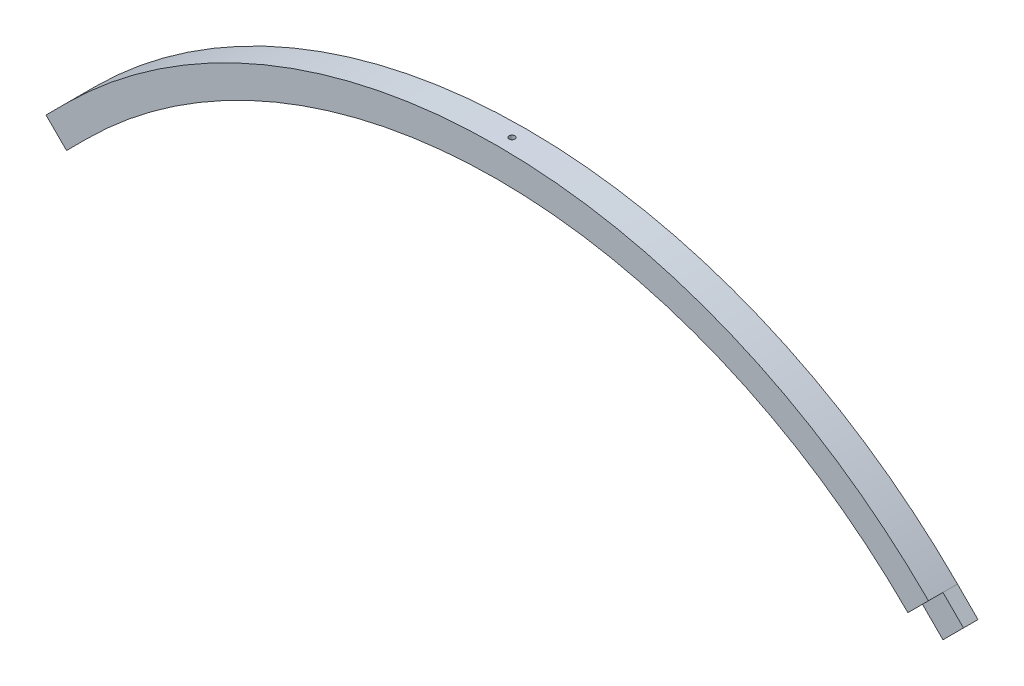
ISO-10303-21;
HEADER;
FILE_DESCRIPTION(('STEP AP214'),'2;1');
FILE_NAME('part.step','',(''),(''),'','','');
FILE_SCHEMA(('AUTOMOTIVE_DESIGN { 1 0 10303 214 1 1 1 1 }'));
ENDSEC;
DATA;
#1=APPLICATION_CONTEXT('core data for automotive mechanical design processes');
#2=APPLICATION_PROTOCOL_DEFINITION('international standard','automotive_design',2000,#1);
#3=PRODUCT_CONTEXT('',#1,'mechanical');
#4=PRODUCT('Part','Part','',(#3));
#5=PRODUCT_RELATED_PRODUCT_CATEGORY('part','',(#4));
#6=PRODUCT_DEFINITION_FORMATION('','',#4);
#7=PRODUCT_DEFINITION_CONTEXT('part definition',#1,'design');
#8=PRODUCT_DEFINITION('design','',#6,#7);
#9=PRODUCT_DEFINITION_SHAPE('','',#8);
#10=(LENGTH_UNIT() NAMED_UNIT(*) SI_UNIT(.MILLI.,.METRE.));
#11=(NAMED_UNIT(*) PLANE_ANGLE_UNIT() SI_UNIT($,.RADIAN.));
#12=(NAMED_UNIT(*) SI_UNIT($,.STERADIAN.) SOLID_ANGLE_UNIT());
#13=UNCERTAINTY_MEASURE_WITH_UNIT(LENGTH_MEASURE(1.E-05),#10,'distance_accuracy_value','');
#14=(GEOMETRIC_REPRESENTATION_CONTEXT(3) GLOBAL_UNCERTAINTY_ASSIGNED_CONTEXT((#13)) GLOBAL_UNIT_ASSIGNED_CONTEXT((#10,
#11,#12)) REPRESENTATION_CONTEXT('',''));
#15=CARTESIAN_POINT('',(0.,0.,0.));
#16=DIRECTION('',(0.,0.,1.));
#17=DIRECTION('',(1.,0.,0.));
#18=AXIS2_PLACEMENT_3D('',#15,#16,#17);
#19=CARTESIAN_POINT('',(0.,0.,184.));
#20=DIRECTION('',(0.707106781186547,0.707106781186547,0.));
#21=DIRECTION('',(-0.707106781186548,0.707106781186548,0.));
#22=AXIS2_PLACEMENT_3D('',#19,#20,#21);
#23=PLANE('',#22);
#24=DIRECTION('',(0.707106781186548,-0.707106781186548,0.));
#25=VECTOR('',#24,1.);
#26=CARTESIAN_POINT('',(0.,0.,5.));
#27=LINE('',#26,#25);
#28=CARTESIAN_POINT('',(-148.492424049175,148.492424049175,5.));
#29=VERTEX_POINT('',#28);
#30=CARTESIAN_POINT('',(-141.42135623731,141.42135623731,5.));
#31=VERTEX_POINT('',#30);
#32=EDGE_CURVE('E58',#29,#31,#27,.T.);
#33=ORIENTED_EDGE('',*,*,#32,.F.);
#34=DIRECTION('',(0.,0.,-1.));
#35=VECTOR('',#34,1.);
#36=CARTESIAN_POINT('',(-148.492424049175,148.492424049175,184.));
#37=LINE('',#36,#35);
#38=CARTESIAN_POINT('',(-148.492424049175,148.492424049175,0.));
#39=VERTEX_POINT('',#38);
#40=EDGE_CURVE('E198',#29,#39,#37,.T.);
#41=ORIENTED_EDGE('',*,*,#40,.T.);
#42=DIRECTION('',(-0.707106781186548,0.707106781186548,0.));
#43=VECTOR('',#42,1.);
#44=CARTESIAN_POINT('',(0.,0.,0.));
#45=LINE('',#44,#43);
#46=CARTESIAN_POINT('',(-141.42135623731,141.42135623731,0.));
#47=VERTEX_POINT('',#46);
#48=EDGE_CURVE('E11',#47,#39,#45,.T.);
#49=ORIENTED_EDGE('',*,*,#48,.F.);
#50=DIRECTION('',(0.,0.,-1.));
#51=VECTOR('',#50,1.);
#52=CARTESIAN_POINT('',(-141.42135623731,141.42135623731,184.));
#53=LINE('',#52,#51);
#54=EDGE_CURVE('E201',#31,#47,#53,.T.);
#55=ORIENTED_EDGE('',*,*,#54,.F.);
#56=EDGE_LOOP('',(#33,#41,#49,#55));
#57=FACE_BOUND('',#56,.T.);
#58=ADVANCED_FACE('F41',(#57),#23,.F.);
#59=CARTESIAN_POINT('',(0.,0.,10.));
#60=DIRECTION('',(0.,0.,-1.));
#61=DIRECTION('',(-1.,0.,0.));
#62=AXIS2_PLACEMENT_3D('',#59,#60,#61);
#63=CYLINDRICAL_SURFACE('',#62,210.);
#64=CARTESIAN_POINT('',(0.,0.,0.));
#65=DIRECTION('',(0.,0.,1.));
#66=DIRECTION('',(1.,0.,0.));
#67=AXIS2_PLACEMENT_3D('',#64,#65,#66);
#68=CIRCLE('',#67,210.);
#69=CARTESIAN_POINT('',(148.492424049175,148.492424049175,0.));
#70=VERTEX_POINT('',#69);
#71=EDGE_CURVE('E240',#70,#39,#68,.T.);
#72=ORIENTED_EDGE('',*,*,#71,.T.);
#73=ORIENTED_EDGE('',*,*,#40,.F.);
#74=CARTESIAN_POINT('',(-148.492424049175,148.492424049175,10.));
#75=VERTEX_POINT('',#74);
#76=EDGE_CURVE('E145',#75,#29,#37,.T.);
#77=ORIENTED_EDGE('',*,*,#76,.F.);
#78=CARTESIAN_POINT('',(0.,0.,10.));
#79=DIRECTION('',(0.,0.,1.));
#80=DIRECTION('',(1.,0.,0.));
#81=AXIS2_PLACEMENT_3D('',#78,#79,#80);
#82=CIRCLE('',#81,210.);
#83=CARTESIAN_POINT('',(148.492424049175,148.492424049175,10.));
#84=VERTEX_POINT('',#83);
#85=EDGE_CURVE('E51',#84,#75,#82,.T.);
#86=ORIENTED_EDGE('',*,*,#85,.F.);
#87=DIRECTION('',(0.,0.,-1.));
#88=VECTOR('',#87,1.);
#89=CARTESIAN_POINT('',(148.492424049175,148.492424049175,184.));
#90=LINE('',#89,#88);
#91=CARTESIAN_POINT('',(148.492424049175,148.492424049175,5.));
#92=VERTEX_POINT('',#91);
#93=EDGE_CURVE('E195',#84,#92,#90,.T.);
#94=ORIENTED_EDGE('',*,*,#93,.T.);
#95=DIRECTION('',(0.,0.,1.));
#96=VECTOR('',#95,1.);
#97=CARTESIAN_POINT('',(148.492424049175,148.492424049175,0.));
#98=LINE('',#97,#96);
#99=EDGE_CURVE('E147',#70,#92,#98,.T.);
#100=ORIENTED_EDGE('',*,*,#99,.F.);
#101=EDGE_LOOP('',(#72,#73,#77,#86,#94,#100));
#102=FACE_BOUND('',#101,.T.);
#103=CARTESIAN_POINT('',(0.,210.,4.));
#104=CARTESIAN_POINT('',(-0.0561700973399885,209.999999967803,4.00000249072948));
#105=CARTESIAN_POINT('',(-0.112380915178687,209.999977221737,4.00474849993076));
#106=CARTESIAN_POINT('',(-0.223254452153493,209.999888669815,4.02361539952494));
#107=CARTESIAN_POINT('',(-0.277915225630178,209.999822812142,4.03774757186595));
#108=CARTESIAN_POINT('',(-0.384066351557266,209.999655497524,4.07498445734749));
#109=CARTESIAN_POINT('',(-0.435558205653359,209.999554057597,4.09808488220712));
#110=CARTESIAN_POINT('',(-0.533918386674478,209.999327030359,4.15259663996631));
#111=CARTESIAN_POINT('',(-0.580787858783418,209.999201449054,4.1840059072337));
#112=CARTESIAN_POINT('',(-0.668594596066591,209.998940265267,4.25425036170356));
#113=CARTESIAN_POINT('',(-0.709531197884227,209.998804661668,4.29308637816954));
#114=CARTESIAN_POINT('',(-0.784304886469968,209.998538727261,4.37708139440838));
#115=CARTESIAN_POINT('',(-0.818141694331727,209.99840839666,4.42224064246516));
#116=CARTESIAN_POINT('',(-0.877752940668733,209.998167710082,4.51759833817141));
#117=CARTESIAN_POINT('',(-0.903527491030073,209.998057353828,4.56779671587627));
#118=CARTESIAN_POINT('',(-0.946283091965778,209.997869055953,4.67180811907036));
#119=CARTESIAN_POINT('',(-0.963264160664983,209.997791114266,4.72562113710896));
#120=CARTESIAN_POINT('',(-0.98795074172505,209.997676433188,4.83533398512662));
#121=CARTESIAN_POINT('',(-0.995656307732284,209.99763969356,4.8912338030344));
#122=CARTESIAN_POINT('',(-1.00157329788507,209.997611558056,5.00353358583415));
#123=CARTESIAN_POINT('',(-0.999784739662276,209.997620162096,5.05993354979711));
#124=CARTESIAN_POINT('',(-0.986764350185382,209.99768174343,5.17163223702303));
#125=CARTESIAN_POINT('',(-0.975532592038613,209.997734720379,5.22693096880811));
#126=CARTESIAN_POINT('',(-0.943944735969814,209.997879074326,5.33485794818976));
#127=CARTESIAN_POINT('',(-0.923588628151769,209.997970451365,5.38748619288993));
#128=CARTESIAN_POINT('',(-0.874329840264295,209.998181303839,5.48857840571481));
#129=CARTESIAN_POINT('',(-0.845427127712873,209.998300779381,5.53704235801193));
#130=CARTESIAN_POINT('',(-0.77989563000023,209.998554358769,5.62843004975235));
#131=CARTESIAN_POINT('',(-0.743266847442498,209.998688462609,5.67135379106256));
#132=CARTESIAN_POINT('',(-0.663322546354162,209.998956181116,5.75044305703461));
#133=CARTESIAN_POINT('',(-0.620006960535205,209.999089795778,5.78660851368069));
#134=CARTESIAN_POINT('',(-0.527918886422356,209.999341470639,5.85115406065259));
#135=CARTESIAN_POINT('',(-0.479146397411753,209.999459530836,5.87953414995588));
#136=CARTESIAN_POINT('',(-0.377528994117669,209.999666786438,5.92770332020346));
#137=CARTESIAN_POINT('',(-0.324684079062943,209.999755981837,5.94749239952076));
#138=CARTESIAN_POINT('',(-0.216421951606891,209.999895451666,5.97791775511454));
#139=CARTESIAN_POINT('',(-0.16100473949489,209.999945726099,5.98855403242049));
#140=CARTESIAN_POINT('',(-0.0491717299330348,210.000001685626,6.00037177104708));
#141=CARTESIAN_POINT('',(0.00724405770100269,210.000007371156,6.00155332525426));
#142=CARTESIAN_POINT('',(0.119473255691313,209.999973513037,5.99442831857082));
#143=CARTESIAN_POINT('',(0.175286666038695,209.999933969386,5.98612175754015));
#144=CARTESIAN_POINT('',(0.284726473300373,209.999814111386,5.96025639473023));
#145=CARTESIAN_POINT('',(0.338352880060943,209.99973379722,5.94269763461096));
#146=CARTESIAN_POINT('',(0.44189668042276,209.999541452897,5.89882636017298));
#147=CARTESIAN_POINT('',(0.491814074307881,209.999429422743,5.87251384652424));
#148=CARTESIAN_POINT('',(0.586523271314924,209.999186275654,5.81188176289634));
#149=CARTESIAN_POINT('',(0.631315035010179,209.999055158573,5.7775621313321));
#150=CARTESIAN_POINT('',(0.714501088063849,209.998788620375,5.70189011962905));
#151=CARTESIAN_POINT('',(0.752895374487201,209.998653199255,5.66053773626375));
#152=CARTESIAN_POINT('',(0.822196870755759,209.99839331943,5.57197369125962));
#153=CARTESIAN_POINT('',(0.853104018393986,209.998268860815,5.52476198094343));
#154=CARTESIAN_POINT('',(0.906553421408002,209.998044939316,5.42581978542363));
#155=CARTESIAN_POINT('',(0.929095685867517,209.997945476405,5.37408930512719));
#156=CARTESIAN_POINT('',(0.965175348241904,209.997782760501,5.26757824846587));
#157=CARTESIAN_POINT('',(0.978712788452043,209.997719507338,5.21279768642839));
#158=CARTESIAN_POINT('',(0.996398671057786,209.997636341661,5.10174121818114));
#159=CARTESIAN_POINT('',(1.00054709716782,209.997616429221,5.04546530937781));
#160=CARTESIAN_POINT('',(0.999337140854348,209.997622190259,4.93301645391675));
#161=CARTESIAN_POINT('',(0.993978870486797,209.997647863199,4.87684350605322));
#162=CARTESIAN_POINT('',(0.973907825482695,209.99774189954,4.76619437855318));
#163=CARTESIAN_POINT('',(0.95919503204093,209.997810263027,4.7117182023279));
#164=CARTESIAN_POINT('',(0.920832275565876,209.997981974612,4.60600815560876));
#165=CARTESIAN_POINT('',(0.897182146248233,209.998085323362,4.55477434546173));
#166=CARTESIAN_POINT('',(0.841617083741863,209.99831534841,4.45700642896389));
#167=CARTESIAN_POINT('',(0.809702474426797,209.998442023794,4.41047213854464));
#168=CARTESIAN_POINT('',(0.738517837721311,209.998704411591,4.32342602311546));
#169=CARTESIAN_POINT('',(0.699248507436294,209.998840123146,4.28291362798209));
#170=CARTESIAN_POINT('',(0.614454354204032,209.999105329912,4.20904632239875));
#171=CARTESIAN_POINT('',(0.56892797903191,209.999234823569,4.17569319326952));
#172=CARTESIAN_POINT('',(0.472903899696185,209.999473015319,4.11709084541166));
#173=CARTESIAN_POINT('',(0.422403811002818,209.999581703364,4.09184553874331));
#174=CARTESIAN_POINT('',(0.317921617076429,209.999765817901,4.05022058909796));
#175=CARTESIAN_POINT('',(0.263943772994789,209.999841284243,4.03383031921432));
#176=CARTESIAN_POINT('',(0.174685001282033,209.999930168694,4.01474844785419));
#177=CARTESIAN_POINT('',(0.139984041965225,209.999956242606,4.00922468371461));
#178=CARTESIAN_POINT('',(0.0701940235052931,209.99999116832,4.00184968147773));
#179=CARTESIAN_POINT('',(0.0351049643649845,210.000000020122,3.99999844335378));
#180=CARTESIAN_POINT('',(0.,210.,4.));
#181=B_SPLINE_CURVE_WITH_KNOTS('',3,(#103,#104,#105,#106,#107,#108,#109,#110,#111,#112,#113,
#114,#115,#116,#117,#118,#119,#120,#121,#122,#123,#124,#125,#126,#127,#128,#129,#130,#131,#132,
#133,#134,#135,#136,#137,#138,#139,#140,#141,#142,#143,#144,#145,#146,#147,#148,#149,#150,#151,
#152,#153,#154,#155,#156,#157,#158,#159,#160,#161,#162,#163,#164,#165,#166,#167,#168,#169,#170,
#171,#172,#173,#174,#175,#176,#177,#178,#179,#180),.UNSPECIFIED.,.T.,.F.,(4,2,2,2,2,2,2,2,2,2,2,
2,2,2,2,2,2,2,2,2,2,2,2,2,2,2,2,2,2,2,2,2,2,2,2,2,2,2,4),(0.,0.168382158876448,
0.336967076326025,0.505471481899403,0.673934035488119,0.842415410434632,1.01090340271837,
1.17938905666208,1.34787436332721,1.51635869552558,1.68484271482985,1.85332542977724,
2.02180832745674,2.19029186547598,2.35877534672068,2.52726052350131,2.69574572241089,
2.86423095322859,3.03271616509554,3.20119972170207,3.36968328079536,3.53816608126234,
3.70664886883432,3.87513295229932,4.04361711306192,4.21210267362906,4.38058805123117,
4.54907263745922,4.71755751592946,4.8860404084725,5.05452363971448,5.22301000583974,
5.39148977021382,5.55995357357856,5.72845924451871,5.8970460984664,6.06543017979514,
6.1706649935101,6.27589980646188),.UNSPECIFIED.);
#182=CARTESIAN_POINT('',(0.,210.,4.));
#183=VERTEX_POINT('',#182);
#184=EDGE_CURVE('E210',#183,#183,#181,.T.);
#185=ORIENTED_EDGE('',*,*,#184,.F.);
#186=EDGE_LOOP('',(#185));
#187=FACE_BOUND('',#186,.T.);
#188=ADVANCED_FACE('F43',(#102,#187),#63,.T.);
#189=CARTESIAN_POINT('',(0.,0.,10.));
#190=DIRECTION('',(0.,0.,-1.));
#191=DIRECTION('',(-1.,0.,0.));
#192=AXIS2_PLACEMENT_3D('',#189,#190,#191);
#193=CYLINDRICAL_SURFACE('',#192,200.);
#194=CARTESIAN_POINT('',(-141.42135623731,141.42135623731,10.));
#195=VERTEX_POINT('',#194);
#196=EDGE_CURVE('E202',#195,#31,#53,.T.);
#197=ORIENTED_EDGE('',*,*,#196,.T.);
#198=ORIENTED_EDGE('',*,*,#54,.T.);
#199=CARTESIAN_POINT('',(0.,0.,0.));
#200=DIRECTION('',(0.,0.,1.));
#201=DIRECTION('',(1.,0.,0.));
#202=AXIS2_PLACEMENT_3D('',#199,#200,#201);
#203=CIRCLE('',#202,200.);
#204=CARTESIAN_POINT('',(141.42135623731,141.42135623731,0.));
#205=VERTEX_POINT('',#204);
#206=EDGE_CURVE('E218',#205,#47,#203,.T.);
#207=ORIENTED_EDGE('',*,*,#206,.F.);
#208=DIRECTION('',(0.,0.,-1.));
#209=VECTOR('',#208,1.);
#210=CARTESIAN_POINT('',(141.42135623731,141.42135623731,0.));
#211=LINE('',#210,#209);
#212=CARTESIAN_POINT('',(141.42135623731,141.42135623731,5.));
#213=VERTEX_POINT('',#212);
#214=EDGE_CURVE('E162',#213,#205,#211,.T.);
#215=ORIENTED_EDGE('',*,*,#214,.F.);
#216=DIRECTION('',(0.,0.,-1.));
#217=VECTOR('',#216,1.);
#218=CARTESIAN_POINT('',(141.42135623731,141.42135623731,184.));
#219=LINE('',#218,#217);
#220=CARTESIAN_POINT('',(141.42135623731,141.42135623731,10.));
#221=VERTEX_POINT('',#220);
#222=EDGE_CURVE('E192',#221,#213,#219,.T.);
#223=ORIENTED_EDGE('',*,*,#222,.F.);
#224=CARTESIAN_POINT('',(0.,0.,10.));
#225=DIRECTION('',(0.,0.,1.));
#226=DIRECTION('',(1.,0.,0.));
#227=AXIS2_PLACEMENT_3D('',#224,#225,#226);
#228=CIRCLE('',#227,200.);
#229=EDGE_CURVE('E219',#221,#195,#228,.T.);
#230=ORIENTED_EDGE('',*,*,#229,.T.);
#231=EDGE_LOOP('',(#197,#198,#207,#215,#223,#230));
#232=FACE_BOUND('',#231,.T.);
#233=CARTESIAN_POINT('',(0.,200.,4.));
#234=CARTESIAN_POINT('',(-0.056170062321248,199.999999966194,4.00000249071769));
#235=CARTESIAN_POINT('',(-0.112380844285242,199.999976082854,4.00474849402431));
#236=CARTESIAN_POINT('',(-0.223254308096942,199.999883103454,4.02361536884016));
#237=CARTESIAN_POINT('',(-0.27791504432338,199.999813952985,4.03774752206049));
#238=CARTESIAN_POINT('',(-0.384066095560467,199.999638272854,4.07498435376356));
#239=CARTESIAN_POINT('',(-0.435557912309895,199.99953176106,4.09808474370485));
#240=CARTESIAN_POINT('',(-0.533918026049115,199.999293382719,4.15259641603761));
#241=CARTESIAN_POINT('',(-0.580787468167009,199.999161522477,4.18400563289847));
#242=CARTESIAN_POINT('',(-0.668594190881557,199.998887279603,4.25424999940426));
#243=CARTESIAN_POINT('',(-0.709530803812489,199.99874489579,4.29308598370004));
#244=CARTESIAN_POINT('',(-0.784304522659981,199.998465664511,4.37708093752957));
#245=CARTESIAN_POINT('',(-0.818141349660451,199.998328817261,4.42224015535628));
#246=CARTESIAN_POINT('',(-0.877752657405698,199.998076095979,4.51759782080109));
#247=CARTESIAN_POINT('',(-0.903527246113835,199.997960221665,4.56779620092667));
#248=CARTESIAN_POINT('',(-0.946282920816334,199.997762508403,4.67180762185926));
#249=CARTESIAN_POINT('',(-0.963264024980886,199.997680669385,4.72562065519698));
#250=CARTESIAN_POINT('',(-0.987950660100581,199.99756025387,4.83533350127118));
#251=CARTESIAN_POINT('',(-0.99565625201323,199.997521677088,4.89123330029122));
#252=CARTESIAN_POINT('',(-1.00157329893483,199.997492134492,5.00353305100347));
#253=CARTESIAN_POINT('',(-0.99978477162908,199.997501168589,5.05993300176382));
#254=CARTESIAN_POINT('',(-0.98676445411595,199.99756582871,5.17163161922145));
#255=CARTESIAN_POINT('',(-0.975532744870778,199.997621454335,5.22693029535648));
#256=CARTESIAN_POINT('',(-0.943945007512559,199.997773025605,5.33485717166767));
#257=CARTESIAN_POINT('',(-0.923588969476465,199.997868971295,5.38748536893952));
#258=CARTESIAN_POINT('',(-0.874330330989778,199.998090366033,5.48857752207404));
#259=CARTESIAN_POINT('',(-0.845427694442941,199.998215815206,5.537041460348));
#260=CARTESIAN_POINT('',(-0.779896359024535,199.99848207332,5.62842914040521));
#261=CARTESIAN_POINT('',(-0.743267662702754,199.998622882256,5.67135288401684));
#262=CARTESIAN_POINT('',(-0.663323497455428,199.998903986734,5.75044221660956));
#263=CARTESIAN_POINT('',(-0.620007954438285,199.999044282269,5.78660773069829));
#264=CARTESIAN_POINT('',(-0.527919952058274,199.999308541243,5.85115340007946));
#265=CARTESIAN_POINT('',(-0.479147491978324,199.999432504678,5.87953355434885));
#266=CARTESIAN_POINT('',(-0.377530128024111,199.999650123589,5.92770285945732));
#267=CARTESIAN_POINT('',(-0.324685223281506,199.999743779057,5.94749200846459));
#268=CARTESIAN_POINT('',(-0.216423099224106,199.999890223005,5.97791750208509));
#269=CARTESIAN_POINT('',(-0.161005880216417,199.999943011489,5.98855384779105));
#270=CARTESIAN_POINT('',(-0.0491728995461689,200.000001769608,6.00037171153435));
#271=CARTESIAN_POINT('',(0.00724285129433168,200.000007739749,6.00155333197892));
#272=CARTESIAN_POINT('',(0.119471986652279,199.999972189438,5.99442846900128));
#273=CARTESIAN_POINT('',(0.175285371162706,199.999930668984,5.98612198546851));
#274=CARTESIAN_POINT('',(0.284725112070412,199.999804818873,5.9602567945524));
#275=CARTESIAN_POINT('',(0.338351479332831,199.999720489427,5.94269813314009));
#276=CARTESIAN_POINT('',(0.441895218487382,199.999518528713,5.89882707454528));
#277=CARTESIAN_POINT('',(0.491812590642801,199.999400897446,5.87251467798419));
#278=CARTESIAN_POINT('',(0.586521806567224,199.999145593573,5.81188281898436));
#279=CARTESIAN_POINT('',(0.631313606796799,199.999007920795,5.77756328853616));
#280=CARTESIAN_POINT('',(0.714499753014752,199.998728055801,5.70189147608246));
#281=CARTESIAN_POINT('',(0.752894096032662,199.998585863582,5.66053919081154));
#282=CARTESIAN_POINT('',(0.822195755744132,199.998312989345,5.5719752954441));
#283=CARTESIAN_POINT('',(0.853103004104064,199.998182307431,5.52476363187584));
#284=CARTESIAN_POINT('',(0.906552614219656,199.997947188978,5.42582150629));
#285=CARTESIAN_POINT('',(0.929094985085006,199.99784275241,5.37409104919365));
#286=CARTESIAN_POINT('',(0.965174852056985,199.997671899672,5.26758003796405));
#287=CARTESIAN_POINT('',(0.97871239444897,199.997605483306,5.21279949950996));
#288=CARTESIAN_POINT('',(0.996398483371696,199.997518158252,5.10174305772909));
#289=CARTESIAN_POINT('',(1.00054701368177,199.997497249644,5.04546715181903));
#290=CARTESIAN_POINT('',(0.99933726447785,199.997503297705,4.93301834213346));
#291=CARTESIAN_POINT('',(0.993979106648113,199.997530253763,4.87684543704876));
#292=CARTESIAN_POINT('',(0.973908302076572,199.997628990885,4.76619637690861));
#293=CARTESIAN_POINT('',(0.959195636530153,199.99770077204,4.71172022526425));
#294=CARTESIAN_POINT('',(0.920833149689645,199.997881068264,4.60601020705257));
#295=CARTESIAN_POINT('',(0.897183162129576,199.997989584016,4.55477640082512));
#296=CARTESIAN_POINT('',(0.841618393670474,199.998231109574,4.45700846593905));
#297=CARTESIAN_POINT('',(0.809703936578332,199.998364118419,4.41047415325071));
#298=CARTESIAN_POINT('',(0.738519572114949,199.998639625319,4.32342791723323));
#299=CARTESIAN_POINT('',(0.69925035438589,199.998782122483,4.28291542988708));
#300=CARTESIAN_POINT('',(0.614456409374236,199.999060589871,4.20904791976644));
#301=CARTESIAN_POINT('',(0.568930129877819,199.999196558462,4.17569467829012));
#302=CARTESIAN_POINT('',(0.472906196910323,199.999446660571,4.11709207483561));
#303=CARTESIAN_POINT('',(0.422406156730449,199.999560783526,4.09184662846493));
#304=CARTESIAN_POINT('',(0.317924028435039,199.999754104943,4.05022139492558));
#305=CARTESIAN_POINT('',(0.263946201449254,199.999833345244,4.03383098100085));
#306=CARTESIAN_POINT('',(0.174687045784321,199.999926675409,4.01474879561386));
#307=CARTESIAN_POINT('',(0.139985686358021,199.999954053656,4.00922490137315));
#308=CARTESIAN_POINT('',(0.0701948530477591,199.999990726516,4.0018497252518));
#309=CARTESIAN_POINT('',(0.0351053791668998,200.000000021128,3.99999844334178));
#310=CARTESIAN_POINT('',(0.,200.,4.));
#311=B_SPLINE_CURVE_WITH_KNOTS('',3,(#233,#234,#235,#236,#237,#238,#239,#240,#241,#242,#243,
#244,#245,#246,#247,#248,#249,#250,#251,#252,#253,#254,#255,#256,#257,#258,#259,#260,#261,#262,
#263,#264,#265,#266,#267,#268,#269,#270,#271,#272,#273,#274,#275,#276,#277,#278,#279,#280,#281,
#282,#283,#284,#285,#286,#287,#288,#289,#290,#291,#292,#293,#294,#295,#296,#297,#298,#299,#300,
#301,#302,#303,#304,#305,#306,#307,#308,#309,#310),.UNSPECIFIED.,.T.,.F.,(4,2,2,2,2,2,2,2,2,2,2,
2,2,2,2,2,2,2,2,2,2,2,2,2,2,2,2,2,2,2,2,2,2,2,2,2,2,2,4),(0.,0.168382052294283,
0.336966859052232,0.505471148959464,0.673933588888841,0.842414972461973,1.01090297361127,
1.17938871840087,1.34787411504293,1.51635840441398,1.68484237993863,1.85332491096118,
2.0218076252152,2.19029105105994,2.35877442130113,2.52725965850572,2.69574491785062,
2.86423021312074,3.03271548827568,3.20119893850897,3.36968239070585,3.53816500577194,
3.70664760887808,3.87513164306193,4.04361575547605,4.21210140556229,4.38058687216028,
4.54907147272623,4.71755636436977,4.88603909944632,5.05452217321123,5.22300838151492,
5.39148798942607,5.55995180722091,5.72845749218246,5.89704443393292,6.06542860573429,
6.17066466198344,6.27590071739112),.UNSPECIFIED.);
#312=CARTESIAN_POINT('',(0.,200.,4.));
#313=VERTEX_POINT('',#312);
#314=EDGE_CURVE('E209',#313,#313,#311,.T.);
#315=ORIENTED_EDGE('',*,*,#314,.T.);
#316=EDGE_LOOP('',(#315));
#317=FACE_BOUND('',#316,.T.);
#318=ADVANCED_FACE('F230',(#232,#317),#193,.F.);
#319=CARTESIAN_POINT('',(0.,0.,10.));
#320=DIRECTION('',(0.,0.,1.));
#321=DIRECTION('',(1.,0.,0.));
#322=AXIS2_PLACEMENT_3D('',#319,#320,#321);
#323=PLANE('',#322);
#324=ORIENTED_EDGE('',*,*,#85,.T.);
#325=DIRECTION('',(0.707106781186548,0.707106781186547,0.));
#326=VECTOR('',#325,1.);
#327=CARTESIAN_POINT('',(-155.563491861041,141.42135623731,10.));
#328=LINE('',#327,#326);
#329=CARTESIAN_POINT('',(-155.563491861041,141.42135623731,10.));
#330=VERTEX_POINT('',#329);
#331=EDGE_CURVE('E263',#330,#75,#328,.T.);
#332=ORIENTED_EDGE('',*,*,#331,.F.);
#333=DIRECTION('',(-0.707106781186548,0.707106781186548,0.));
#334=VECTOR('',#333,1.);
#335=CARTESIAN_POINT('',(-7.07106781186546,-7.07106781186545,10.));
#336=LINE('',#335,#334);
#337=CARTESIAN_POINT('',(-148.492424049175,134.350288425444,10.));
#338=VERTEX_POINT('',#337);
#339=EDGE_CURVE('E138',#338,#330,#336,.T.);
#340=ORIENTED_EDGE('',*,*,#339,.F.);
#341=DIRECTION('',(0.707106781186548,0.707106781186547,0.));
#342=VECTOR('',#341,1.);
#343=CARTESIAN_POINT('',(-148.492424049175,134.350288425444,10.));
#344=LINE('',#343,#342);
#345=EDGE_CURVE('E153',#338,#195,#344,.T.);
#346=ORIENTED_EDGE('',*,*,#345,.T.);
#347=ORIENTED_EDGE('',*,*,#229,.F.);
#348=DIRECTION('',(0.707106781186548,0.707106781186548,0.));
#349=VECTOR('',#348,1.);
#350=CARTESIAN_POINT('',(0.,0.,10.));
#351=LINE('',#350,#349);
#352=EDGE_CURVE('E205',#221,#84,#351,.T.);
#353=ORIENTED_EDGE('',*,*,#352,.T.);
#354=EDGE_LOOP('',(#324,#332,#340,#346,#347,#353));
#355=FACE_BOUND('',#354,.T.);
#356=ADVANCED_FACE('F261',(#355),#323,.T.);
#357=CARTESIAN_POINT('',(0.,0.,0.));
#358=DIRECTION('',(0.,0.,1.));
#359=DIRECTION('',(1.,0.,0.));
#360=AXIS2_PLACEMENT_3D('',#357,#358,#359);
#361=PLANE('',#360);
#362=ORIENTED_EDGE('',*,*,#206,.T.);
#363=ORIENTED_EDGE('',*,*,#48,.T.);
#364=ORIENTED_EDGE('',*,*,#71,.F.);
#365=DIRECTION('',(-0.707106781186548,0.707106781186547,0.));
#366=VECTOR('',#365,1.);
#367=CARTESIAN_POINT('',(155.563491861041,141.42135623731,0.));
#368=LINE('',#367,#366);
#369=CARTESIAN_POINT('',(155.563491861041,141.42135623731,0.));
#370=VERTEX_POINT('',#369);
#371=EDGE_CURVE('E170',#370,#70,#368,.T.);
#372=ORIENTED_EDGE('',*,*,#371,.F.);
#373=DIRECTION('',(0.707106781186548,0.707106781186548,0.));
#374=VECTOR('',#373,1.);
#375=CARTESIAN_POINT('',(7.07106781186545,-7.07106781186545,0.));
#376=LINE('',#375,#374);
#377=CARTESIAN_POINT('',(148.492424049175,134.350288425444,0.));
#378=VERTEX_POINT('',#377);
#379=EDGE_CURVE('E168',#378,#370,#376,.T.);
#380=ORIENTED_EDGE('',*,*,#379,.F.);
#381=DIRECTION('',(-0.707106781186548,0.707106781186547,0.));
#382=VECTOR('',#381,1.);
#383=CARTESIAN_POINT('',(148.492424049175,134.350288425444,0.));
#384=LINE('',#383,#382);
#385=EDGE_CURVE('E180',#378,#205,#384,.T.);
#386=ORIENTED_EDGE('',*,*,#385,.T.);
#387=EDGE_LOOP('',(#362,#363,#364,#372,#380,#386));
#388=FACE_BOUND('',#387,.T.);
#389=ADVANCED_FACE('F227',(#388),#361,.F.);
#390=CARTESIAN_POINT('',(0.,290.,5.));
#391=DIRECTION('',(0.,-1.,0.));
#392=DIRECTION('',(0.,0.,-1.));
#393=AXIS2_PLACEMENT_3D('',#390,#391,#392);
#394=CYLINDRICAL_SURFACE('',#393,1.);
#395=ORIENTED_EDGE('',*,*,#314,.F.);
#396=EDGE_LOOP('',(#395));
#397=FACE_BOUND('',#396,.T.);
#398=ORIENTED_EDGE('',*,*,#184,.T.);
#399=EDGE_LOOP('',(#398));
#400=FACE_BOUND('',#399,.T.);
#401=ADVANCED_FACE('F221',(#397,#400),#394,.F.);
#402=CARTESIAN_POINT('',(0.,0.,184.));
#403=DIRECTION('',(0.707106781186547,-0.707106781186547,0.));
#404=DIRECTION('',(0.707106781186548,0.707106781186548,0.));
#405=AXIS2_PLACEMENT_3D('',#402,#403,#404);
#406=PLANE('',#405);
#407=DIRECTION('',(-0.707106781186548,-0.707106781186548,0.));
#408=VECTOR('',#407,1.);
#409=CARTESIAN_POINT('',(0.,0.,5.));
#410=LINE('',#409,#408);
#411=EDGE_CURVE('E66',#92,#213,#410,.T.);
#412=ORIENTED_EDGE('',*,*,#411,.F.);
#413=ORIENTED_EDGE('',*,*,#93,.F.);
#414=ORIENTED_EDGE('',*,*,#352,.F.);
#415=ORIENTED_EDGE('',*,*,#222,.T.);
#416=EDGE_LOOP('',(#412,#413,#414,#415));
#417=FACE_BOUND('',#416,.T.);
#418=ADVANCED_FACE('F226',(#417),#406,.T.);
#419=CARTESIAN_POINT('',(155.563491861041,141.42135623731,0.));
#420=DIRECTION('',(-0.707106781186547,-0.707106781186548,0.));
#421=DIRECTION('',(0.707106781186548,-0.707106781186547,0.));
#422=AXIS2_PLACEMENT_3D('',#419,#420,#421);
#423=PLANE('',#422);
#424=ORIENTED_EDGE('',*,*,#99,.T.);
#425=DIRECTION('',(-0.707106781186548,0.707106781186547,0.));
#426=VECTOR('',#425,1.);
#427=CARTESIAN_POINT('',(155.563491861041,141.42135623731,5.));
#428=LINE('',#427,#426);
#429=CARTESIAN_POINT('',(155.563491861041,141.42135623731,5.));
#430=VERTEX_POINT('',#429);
#431=EDGE_CURVE('E188',#430,#92,#428,.T.);
#432=ORIENTED_EDGE('',*,*,#431,.F.);
#433=DIRECTION('',(0.,0.,1.));
#434=VECTOR('',#433,1.);
#435=CARTESIAN_POINT('',(155.563491861041,141.42135623731,0.));
#436=LINE('',#435,#434);
#437=EDGE_CURVE('E157',#370,#430,#436,.T.);
#438=ORIENTED_EDGE('',*,*,#437,.F.);
#439=ORIENTED_EDGE('',*,*,#371,.T.);
#440=EDGE_LOOP('',(#424,#432,#438,#439));
#441=FACE_BOUND('',#440,.T.);
#442=ADVANCED_FACE('F283',(#441),#423,.F.);
#443=CARTESIAN_POINT('',(7.07106781186545,-7.07106781186545,5.));
#444=DIRECTION('',(0.,0.,-1.));
#445=DIRECTION('',(-1.,0.,0.));
#446=AXIS2_PLACEMENT_3D('',#443,#444,#445);
#447=PLANE('',#446);
#448=ORIENTED_EDGE('',*,*,#411,.T.);
#449=DIRECTION('',(-0.707106781186548,0.707106781186547,0.));
#450=VECTOR('',#449,1.);
#451=CARTESIAN_POINT('',(148.492424049175,134.350288425444,5.));
#452=LINE('',#451,#450);
#453=CARTESIAN_POINT('',(148.492424049175,134.350288425444,5.));
#454=VERTEX_POINT('',#453);
#455=EDGE_CURVE('E184',#454,#213,#452,.T.);
#456=ORIENTED_EDGE('',*,*,#455,.F.);
#457=DIRECTION('',(-0.707106781186548,-0.707106781186548,0.));
#458=VECTOR('',#457,1.);
#459=CARTESIAN_POINT('',(7.07106781186545,-7.07106781186545,5.));
#460=LINE('',#459,#458);
#461=EDGE_CURVE('E161',#430,#454,#460,.T.);
#462=ORIENTED_EDGE('',*,*,#461,.F.);
#463=ORIENTED_EDGE('',*,*,#431,.T.);
#464=EDGE_LOOP('',(#448,#456,#462,#463));
#465=FACE_BOUND('',#464,.T.);
#466=ADVANCED_FACE('F293',(#465),#447,.F.);
#467=CARTESIAN_POINT('',(148.492424049175,134.350288425444,0.));
#468=DIRECTION('',(0.707106781186547,0.707106781186548,0.));
#469=DIRECTION('',(-0.707106781186548,0.707106781186547,0.));
#470=AXIS2_PLACEMENT_3D('',#467,#468,#469);
#471=PLANE('',#470);
#472=ORIENTED_EDGE('',*,*,#214,.T.);
#473=ORIENTED_EDGE('',*,*,#385,.F.);
#474=DIRECTION('',(0.,0.,-1.));
#475=VECTOR('',#474,1.);
#476=CARTESIAN_POINT('',(148.492424049175,134.350288425444,0.));
#477=LINE('',#476,#475);
#478=EDGE_CURVE('E165',#454,#378,#477,.T.);
#479=ORIENTED_EDGE('',*,*,#478,.F.);
#480=ORIENTED_EDGE('',*,*,#455,.T.);
#481=EDGE_LOOP('',(#472,#473,#479,#480));
#482=FACE_BOUND('',#481,.T.);
#483=ADVANCED_FACE('F291',(#482),#471,.F.);
#484=CARTESIAN_POINT('',(7.07106781186545,-7.07106781186545,0.));
#485=DIRECTION('',(0.707106781186548,-0.707106781186548,0.));
#486=DIRECTION('',(0.707106781186548,0.707106781186548,0.));
#487=AXIS2_PLACEMENT_3D('',#484,#485,#486);
#488=PLANE('',#487);
#489=ORIENTED_EDGE('',*,*,#437,.T.);
#490=ORIENTED_EDGE('',*,*,#461,.T.);
#491=ORIENTED_EDGE('',*,*,#478,.T.);
#492=ORIENTED_EDGE('',*,*,#379,.T.);
#493=EDGE_LOOP('',(#489,#490,#491,#492));
#494=FACE_BOUND('',#493,.T.);
#495=ADVANCED_FACE('F286',(#494),#488,.T.);
#496=CARTESIAN_POINT('',(-155.563491861041,141.42135623731,0.));
#497=DIRECTION('',(0.707106781186547,-0.707106781186548,0.));
#498=DIRECTION('',(0.707106781186548,0.707106781186547,0.));
#499=AXIS2_PLACEMENT_3D('',#496,#497,#498);
#500=PLANE('',#499);
#501=ORIENTED_EDGE('',*,*,#76,.T.);
#502=DIRECTION('',(0.707106781186548,0.707106781186547,0.));
#503=VECTOR('',#502,1.);
#504=CARTESIAN_POINT('',(-155.563491861041,141.42135623731,5.));
#505=LINE('',#504,#503);
#506=CARTESIAN_POINT('',(-155.563491861041,141.42135623731,5.));
#507=VERTEX_POINT('',#506);
#508=EDGE_CURVE('E125',#507,#29,#505,.T.);
#509=ORIENTED_EDGE('',*,*,#508,.F.);
#510=DIRECTION('',(0.,0.,-1.));
#511=VECTOR('',#510,1.);
#512=CARTESIAN_POINT('',(-155.563491861041,141.42135623731,0.));
#513=LINE('',#512,#511);
#514=EDGE_CURVE('E133',#330,#507,#513,.T.);
#515=ORIENTED_EDGE('',*,*,#514,.F.);
#516=ORIENTED_EDGE('',*,*,#331,.T.);
#517=EDGE_LOOP('',(#501,#509,#515,#516));
#518=FACE_BOUND('',#517,.T.);
#519=ADVANCED_FACE('F144',(#518),#500,.F.);
#520=CARTESIAN_POINT('',(-7.07106781186546,-7.07106781186545,5.));
#521=DIRECTION('',(0.,0.,1.));
#522=DIRECTION('',(1.,0.,0.));
#523=AXIS2_PLACEMENT_3D('',#520,#521,#522);
#524=PLANE('',#523);
#525=ORIENTED_EDGE('',*,*,#32,.T.);
#526=DIRECTION('',(0.707106781186548,0.707106781186547,0.));
#527=VECTOR('',#526,1.);
#528=CARTESIAN_POINT('',(-148.492424049175,134.350288425444,5.));
#529=LINE('',#528,#527);
#530=CARTESIAN_POINT('',(-148.492424049175,134.350288425444,5.));
#531=VERTEX_POINT('',#530);
#532=EDGE_CURVE('E128',#531,#31,#529,.T.);
#533=ORIENTED_EDGE('',*,*,#532,.F.);
#534=DIRECTION('',(0.707106781186548,-0.707106781186548,0.));
#535=VECTOR('',#534,1.);
#536=CARTESIAN_POINT('',(-7.07106781186546,-7.07106781186545,5.));
#537=LINE('',#536,#535);
#538=EDGE_CURVE('E121',#507,#531,#537,.T.);
#539=ORIENTED_EDGE('',*,*,#538,.F.);
#540=ORIENTED_EDGE('',*,*,#508,.T.);
#541=EDGE_LOOP('',(#525,#533,#539,#540));
#542=FACE_BOUND('',#541,.T.);
#543=ADVANCED_FACE('F123',(#542),#524,.F.);
#544=CARTESIAN_POINT('',(-148.492424049175,134.350288425444,0.));
#545=DIRECTION('',(-0.707106781186547,0.707106781186548,0.));
#546=DIRECTION('',(-0.707106781186548,-0.707106781186547,0.));
#547=AXIS2_PLACEMENT_3D('',#544,#545,#546);
#548=PLANE('',#547);
#549=ORIENTED_EDGE('',*,*,#196,.F.);
#550=ORIENTED_EDGE('',*,*,#345,.F.);
#551=DIRECTION('',(0.,0.,1.));
#552=VECTOR('',#551,1.);
#553=CARTESIAN_POINT('',(-148.492424049175,134.350288425444,0.));
#554=LINE('',#553,#552);
#555=EDGE_CURVE('E132',#531,#338,#554,.T.);
#556=ORIENTED_EDGE('',*,*,#555,.F.);
#557=ORIENTED_EDGE('',*,*,#532,.T.);
#558=EDGE_LOOP('',(#549,#550,#556,#557));
#559=FACE_BOUND('',#558,.T.);
#560=ADVANCED_FACE('F260',(#559),#548,.F.);
#561=CARTESIAN_POINT('',(-7.07106781186546,-7.07106781186545,0.));
#562=DIRECTION('',(-0.707106781186548,-0.707106781186548,0.));
#563=DIRECTION('',(0.707106781186548,-0.707106781186548,0.));
#564=AXIS2_PLACEMENT_3D('',#561,#562,#563);
#565=PLANE('',#564);
#566=ORIENTED_EDGE('',*,*,#514,.T.);
#567=ORIENTED_EDGE('',*,*,#538,.T.);
#568=ORIENTED_EDGE('',*,*,#555,.T.);
#569=ORIENTED_EDGE('',*,*,#339,.T.);
#570=EDGE_LOOP('',(#566,#567,#568,#569));
#571=FACE_BOUND('',#570,.T.);
#572=ADVANCED_FACE('F136',(#571),#565,.T.);
#573=CLOSED_SHELL('',(#58,#188,#318,#356,#389,#401,#418,#442,#466,#483,#495,#519,#543,#560,#572));
#574=MANIFOLD_SOLID_BREP('B2',#573);
#575=ADVANCED_BREP_SHAPE_REPRESENTATION('',(#18,#574),#14);
#576=SHAPE_DEFINITION_REPRESENTATION(#9,#575);
ENDSEC;
END-ISO-10303-21;
